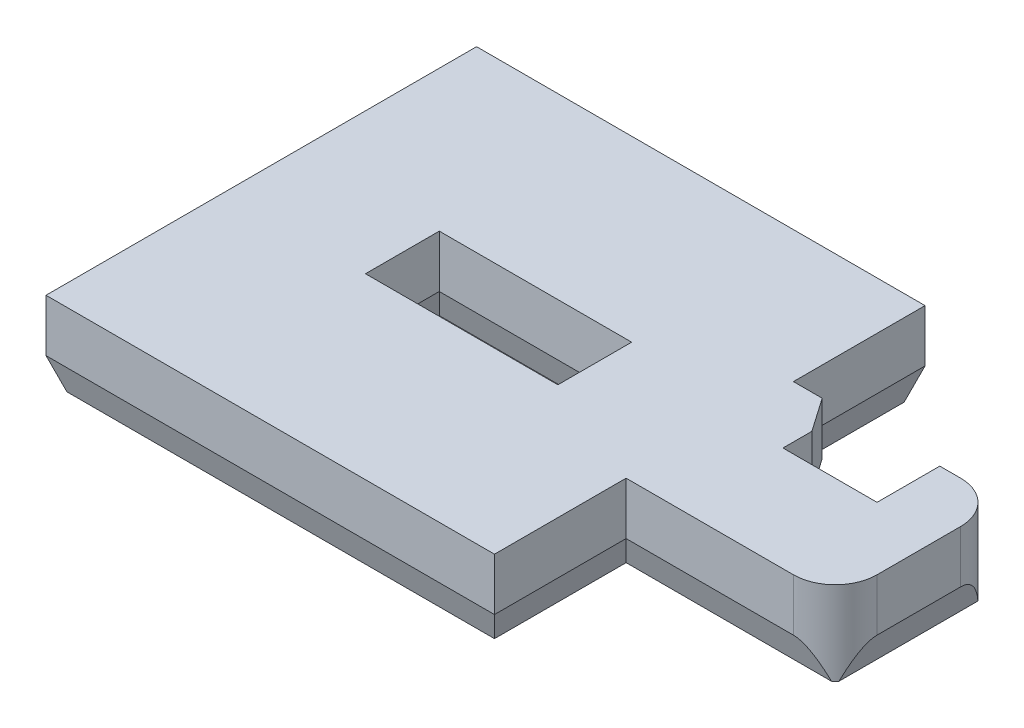
ISO-10303-21;
HEADER;
FILE_DESCRIPTION(('STEP AP214'),'2;1');
FILE_NAME('part.step','',(''),(''),'','','');
FILE_SCHEMA(('AUTOMOTIVE_DESIGN { 1 0 10303 214 1 1 1 1 }'));
ENDSEC;
DATA;
#1=APPLICATION_CONTEXT('core data for automotive mechanical design processes');
#2=APPLICATION_PROTOCOL_DEFINITION('international standard','automotive_design',2000,#1);
#3=PRODUCT_CONTEXT('',#1,'mechanical');
#4=PRODUCT('Part','Part','',(#3));
#5=PRODUCT_RELATED_PRODUCT_CATEGORY('part','',(#4));
#6=PRODUCT_DEFINITION_FORMATION('','',#4);
#7=PRODUCT_DEFINITION_CONTEXT('part definition',#1,'design');
#8=PRODUCT_DEFINITION('design','',#6,#7);
#9=PRODUCT_DEFINITION_SHAPE('','',#8);
#10=(LENGTH_UNIT() NAMED_UNIT(*) SI_UNIT(.MILLI.,.METRE.));
#11=(NAMED_UNIT(*) PLANE_ANGLE_UNIT() SI_UNIT($,.RADIAN.));
#12=(NAMED_UNIT(*) SI_UNIT($,.STERADIAN.) SOLID_ANGLE_UNIT());
#13=UNCERTAINTY_MEASURE_WITH_UNIT(LENGTH_MEASURE(1.E-05),#10,'distance_accuracy_value','');
#14=(GEOMETRIC_REPRESENTATION_CONTEXT(3) GLOBAL_UNCERTAINTY_ASSIGNED_CONTEXT((#13)) GLOBAL_UNIT_ASSIGNED_CONTEXT((#10,
#11,#12)) REPRESENTATION_CONTEXT('',''));
#15=CARTESIAN_POINT('',(0.,0.,0.));
#16=DIRECTION('',(0.,0.,1.));
#17=DIRECTION('',(1.,0.,0.));
#18=AXIS2_PLACEMENT_3D('',#15,#16,#17);
#19=CARTESIAN_POINT('',(0.,4.,0.));
#20=DIRECTION('',(0.,1.,0.));
#21=DIRECTION('',(0.,0.,1.));
#22=AXIS2_PLACEMENT_3D('',#19,#20,#21);
#23=PLANE('',#22);
#24=DIRECTION('',(-1.,0.,0.));
#25=VECTOR('',#24,1.);
#26=CARTESIAN_POINT('',(4.7,4.,-1.765));
#27=LINE('',#26,#25);
#28=CARTESIAN_POINT('',(4.7,4.,-1.765));
#29=VERTEX_POINT('',#28);
#30=CARTESIAN_POINT('',(-4.5,4.,-1.765));
#31=VERTEX_POINT('',#30);
#32=EDGE_CURVE('E261',#29,#31,#27,.T.);
#33=ORIENTED_EDGE('',*,*,#32,.F.);
#34=DIRECTION('',(0.,0.,-1.));
#35=VECTOR('',#34,1.);
#36=CARTESIAN_POINT('',(4.7,4.,1.765));
#37=LINE('',#36,#35);
#38=CARTESIAN_POINT('',(4.7,4.,1.765));
#39=VERTEX_POINT('',#38);
#40=EDGE_CURVE('E259',#39,#29,#37,.T.);
#41=ORIENTED_EDGE('',*,*,#40,.F.);
#42=DIRECTION('',(1.,0.,0.));
#43=VECTOR('',#42,1.);
#44=CARTESIAN_POINT('',(4.7,4.,1.765));
#45=LINE('',#44,#43);
#46=CARTESIAN_POINT('',(-4.5,4.,1.765));
#47=VERTEX_POINT('',#46);
#48=EDGE_CURVE('E266',#47,#39,#45,.T.);
#49=ORIENTED_EDGE('',*,*,#48,.F.);
#50=DIRECTION('',(0.,0.,1.));
#51=VECTOR('',#50,1.);
#52=CARTESIAN_POINT('',(-4.5,4.,1.765));
#53=LINE('',#52,#51);
#54=EDGE_CURVE('E263',#31,#47,#53,.T.);
#55=ORIENTED_EDGE('',*,*,#54,.F.);
#56=EDGE_LOOP('',(#33,#41,#49,#55));
#57=FACE_BOUND('',#56,.T.);
#58=DIRECTION('',(0.,0.,-1.));
#59=VECTOR('',#58,1.);
#60=CARTESIAN_POINT('',(20.2,4.,-4.));
#61=LINE('',#60,#59);
#62=CARTESIAN_POINT('',(20.2,4.,2.));
#63=VERTEX_POINT('',#62);
#64=CARTESIAN_POINT('',(20.2,4.,-2.));
#65=VERTEX_POINT('',#64);
#66=EDGE_CURVE('E250',#63,#65,#61,.T.);
#67=ORIENTED_EDGE('',*,*,#66,.T.);
#68=CARTESIAN_POINT('',(18.2,4.,-2.));
#69=DIRECTION('',(0.,1.,0.));
#70=DIRECTION('',(0.,0.,1.));
#71=AXIS2_PLACEMENT_3D('',#68,#69,#70);
#72=CIRCLE('',#71,2.);
#73=CARTESIAN_POINT('',(18.2,4.,-4.));
#74=VERTEX_POINT('',#73);
#75=EDGE_CURVE('E436',#65,#74,#72,.T.);
#76=ORIENTED_EDGE('',*,*,#75,.T.);
#77=DIRECTION('',(-1.,0.,0.));
#78=VECTOR('',#77,1.);
#79=CARTESIAN_POINT('',(10.2,4.,-4.));
#80=LINE('',#79,#78);
#81=CARTESIAN_POINT('',(17.2,4.,-4.));
#82=VERTEX_POINT('',#81);
#83=EDGE_CURVE('E249',#74,#82,#80,.T.);
#84=ORIENTED_EDGE('',*,*,#83,.T.);
#85=DIRECTION('',(0.,0.,-1.));
#86=VECTOR('',#85,1.);
#87=CARTESIAN_POINT('',(17.2,4.,-4.));
#88=LINE('',#87,#86);
#89=CARTESIAN_POINT('',(17.2,4.,-1.));
#90=VERTEX_POINT('',#89);
#91=EDGE_CURVE('E944',#90,#82,#88,.T.);
#92=ORIENTED_EDGE('',*,*,#91,.F.);
#93=DIRECTION('',(1.,0.,0.));
#94=VECTOR('',#93,1.);
#95=CARTESIAN_POINT('',(12.7,4.,-1.));
#96=LINE('',#95,#94);
#97=CARTESIAN_POINT('',(12.7,4.,-1.));
#98=VERTEX_POINT('',#97);
#99=EDGE_CURVE('E945',#98,#90,#96,.T.);
#100=ORIENTED_EDGE('',*,*,#99,.F.);
#101=DIRECTION('',(0.,0.,1.));
#102=VECTOR('',#101,1.);
#103=CARTESIAN_POINT('',(12.7,4.,-1.));
#104=LINE('',#103,#102);
#105=CARTESIAN_POINT('',(12.7,4.,-2.38454446993003));
#106=VERTEX_POINT('',#105);
#107=EDGE_CURVE('E242',#106,#98,#104,.T.);
#108=ORIENTED_EDGE('',*,*,#107,.F.);
#109=DIRECTION('',(0.571066249139347,0.,0.820903976780425));
#110=VECTOR('',#109,1.);
#111=CARTESIAN_POINT('',(12.7,4.,-2.38454446993003));
#112=LINE('',#111,#110);
#113=CARTESIAN_POINT('',(11.5761997062962,4.,-4.));
#114=VERTEX_POINT('',#113);
#115=EDGE_CURVE('E225',#114,#106,#112,.T.);
#116=ORIENTED_EDGE('',*,*,#115,.F.);
#117=CARTESIAN_POINT('',(10.2,4.,-4.));
#118=VERTEX_POINT('',#117);
#119=EDGE_CURVE('E239',#114,#118,#80,.T.);
#120=ORIENTED_EDGE('',*,*,#119,.T.);
#121=DIRECTION('',(0.,0.,-1.));
#122=VECTOR('',#121,1.);
#123=CARTESIAN_POINT('',(10.2,4.,-10.2954940680572));
#124=LINE('',#123,#122);
#125=CARTESIAN_POINT('',(10.2,4.,-10.2954940680572));
#126=VERTEX_POINT('',#125);
#127=EDGE_CURVE('E285',#118,#126,#124,.T.);
#128=ORIENTED_EDGE('',*,*,#127,.T.);
#129=DIRECTION('',(-1.,0.,0.));
#130=VECTOR('',#129,1.);
#131=CARTESIAN_POINT('',(-11.2475157139505,4.,-10.2954940680572));
#132=LINE('',#131,#130);
#133=CARTESIAN_POINT('',(-11.2475157139505,4.,-10.2954940680572));
#134=VERTEX_POINT('',#133);
#135=EDGE_CURVE('E289',#126,#134,#132,.T.);
#136=ORIENTED_EDGE('',*,*,#135,.T.);
#137=DIRECTION('',(0.,0.,1.));
#138=VECTOR('',#137,1.);
#139=CARTESIAN_POINT('',(-11.2475157139505,4.,-10.2954940680572));
#140=LINE('',#139,#138);
#141=CARTESIAN_POINT('',(-11.2475157139505,4.,10.2954940680572));
#142=VERTEX_POINT('',#141);
#143=EDGE_CURVE('E280',#134,#142,#140,.T.);
#144=ORIENTED_EDGE('',*,*,#143,.T.);
#145=DIRECTION('',(1.,0.,0.));
#146=VECTOR('',#145,1.);
#147=CARTESIAN_POINT('',(-11.2475157139505,4.,10.2954940680572));
#148=LINE('',#147,#146);
#149=CARTESIAN_POINT('',(10.2,4.,10.2954940680572));
#150=VERTEX_POINT('',#149);
#151=EDGE_CURVE('E283',#142,#150,#148,.T.);
#152=ORIENTED_EDGE('',*,*,#151,.T.);
#153=CARTESIAN_POINT('',(10.2,4.,4.));
#154=VERTEX_POINT('',#153);
#155=EDGE_CURVE('E286',#150,#154,#124,.T.);
#156=ORIENTED_EDGE('',*,*,#155,.T.);
#157=DIRECTION('',(1.,0.,0.));
#158=VECTOR('',#157,1.);
#159=CARTESIAN_POINT('',(20.2,4.,4.));
#160=LINE('',#159,#158);
#161=CARTESIAN_POINT('',(18.2,4.,4.));
#162=VERTEX_POINT('',#161);
#163=EDGE_CURVE('E233',#154,#162,#160,.T.);
#164=ORIENTED_EDGE('',*,*,#163,.T.);
#165=CARTESIAN_POINT('',(18.2,4.,2.));
#166=DIRECTION('',(0.,1.,0.));
#167=DIRECTION('',(0.,0.,1.));
#168=AXIS2_PLACEMENT_3D('',#165,#166,#167);
#169=CIRCLE('',#168,2.);
#170=EDGE_CURVE('E434',#162,#63,#169,.T.);
#171=ORIENTED_EDGE('',*,*,#170,.T.);
#172=EDGE_LOOP('',(#67,#76,#84,#92,#100,#108,#116,#120,#128,#136,#144,#152,#156,#164,#171));
#173=FACE_BOUND('',#172,.T.);
#174=ADVANCED_FACE('F35',(#57,#173),#23,.T.);
#175=CARTESIAN_POINT('',(0.,0.,0.));
#176=DIRECTION('',(0.,1.,0.));
#177=DIRECTION('',(0.,0.,1.));
#178=AXIS2_PLACEMENT_3D('',#175,#176,#177);
#179=PLANE('',#178);
#180=DIRECTION('',(1.,0.,0.));
#181=VECTOR('',#180,1.);
#182=CARTESIAN_POINT('',(0.,0.,-3.5));
#183=LINE('',#182,#181);
#184=CARTESIAN_POINT('',(17.7,0.,-3.5));
#185=VERTEX_POINT('',#184);
#186=CARTESIAN_POINT('',(19.5228756555323,0.,-3.5));
#187=VERTEX_POINT('',#186);
#188=EDGE_CURVE('E322',#185,#187,#183,.T.);
#189=ORIENTED_EDGE('',*,*,#188,.T.);
#190=CARTESIAN_POINT('',(18.2,0.,-2.));
#191=DIRECTION('',(0.,1.,0.));
#192=DIRECTION('',(0.,0.,1.));
#193=AXIS2_PLACEMENT_3D('',#190,#191,#192);
#194=CIRCLE('',#193,2.);
#195=CARTESIAN_POINT('',(19.7,0.,-3.3228756555323));
#196=VERTEX_POINT('',#195);
#197=EDGE_CURVE('E423',#187,#196,#194,.F.);
#198=ORIENTED_EDGE('',*,*,#197,.T.);
#199=DIRECTION('',(0.,0.,1.));
#200=VECTOR('',#199,1.);
#201=CARTESIAN_POINT('',(19.7,0.,0.));
#202=LINE('',#201,#200);
#203=CARTESIAN_POINT('',(19.7,0.,3.3228756555323));
#204=VERTEX_POINT('',#203);
#205=EDGE_CURVE('E325',#196,#204,#202,.T.);
#206=ORIENTED_EDGE('',*,*,#205,.T.);
#207=CARTESIAN_POINT('',(18.2,0.,2.));
#208=DIRECTION('',(0.,1.,0.));
#209=DIRECTION('',(0.,0.,1.));
#210=AXIS2_PLACEMENT_3D('',#207,#208,#209);
#211=CIRCLE('',#210,2.);
#212=CARTESIAN_POINT('',(19.5228756555323,0.,3.5));
#213=VERTEX_POINT('',#212);
#214=EDGE_CURVE('E421',#204,#213,#211,.F.);
#215=ORIENTED_EDGE('',*,*,#214,.T.);
#216=DIRECTION('',(-1.,0.,0.));
#217=VECTOR('',#216,1.);
#218=CARTESIAN_POINT('',(0.,0.,3.5));
#219=LINE('',#218,#217);
#220=CARTESIAN_POINT('',(9.7,0.,3.5));
#221=VERTEX_POINT('',#220);
#222=EDGE_CURVE('E328',#213,#221,#219,.T.);
#223=ORIENTED_EDGE('',*,*,#222,.T.);
#224=DIRECTION('',(0.,0.,1.));
#225=VECTOR('',#224,1.);
#226=CARTESIAN_POINT('',(9.7,0.,0.));
#227=LINE('',#226,#225);
#228=CARTESIAN_POINT('',(9.7,0.,9.7954940680572));
#229=VERTEX_POINT('',#228);
#230=EDGE_CURVE('E330',#221,#229,#227,.T.);
#231=ORIENTED_EDGE('',*,*,#230,.T.);
#232=DIRECTION('',(-1.,0.,0.));
#233=VECTOR('',#232,1.);
#234=CARTESIAN_POINT('',(0.,0.,9.7954940680572));
#235=LINE('',#234,#233);
#236=CARTESIAN_POINT('',(-10.7475157139505,0.,9.7954940680572));
#237=VERTEX_POINT('',#236);
#238=EDGE_CURVE('E332',#229,#237,#235,.T.);
#239=ORIENTED_EDGE('',*,*,#238,.T.);
#240=DIRECTION('',(0.,0.,-1.));
#241=VECTOR('',#240,1.);
#242=CARTESIAN_POINT('',(-10.7475157139505,0.,0.));
#243=LINE('',#242,#241);
#244=CARTESIAN_POINT('',(-10.7475157139505,0.,-9.7954940680572));
#245=VERTEX_POINT('',#244);
#246=EDGE_CURVE('E334',#237,#245,#243,.T.);
#247=ORIENTED_EDGE('',*,*,#246,.T.);
#248=DIRECTION('',(1.,0.,0.));
#249=VECTOR('',#248,1.);
#250=CARTESIAN_POINT('',(0.,0.,-9.7954940680572));
#251=LINE('',#250,#249);
#252=CARTESIAN_POINT('',(9.7,0.,-9.7954940680572));
#253=VERTEX_POINT('',#252);
#254=EDGE_CURVE('E336',#245,#253,#251,.T.);
#255=ORIENTED_EDGE('',*,*,#254,.T.);
#256=DIRECTION('',(0.,0.,1.));
#257=VECTOR('',#256,1.);
#258=CARTESIAN_POINT('',(9.7,0.,0.));
#259=LINE('',#258,#257);
#260=CARTESIAN_POINT('',(9.7,0.,-3.5));
#261=VERTEX_POINT('',#260);
#262=EDGE_CURVE('E338',#253,#261,#259,.T.);
#263=ORIENTED_EDGE('',*,*,#262,.T.);
#264=DIRECTION('',(1.,0.,0.));
#265=VECTOR('',#264,1.);
#266=CARTESIAN_POINT('',(0.,0.,-3.5));
#267=LINE('',#266,#265);
#268=CARTESIAN_POINT('',(11.3149427487267,0.,-3.5));
#269=VERTEX_POINT('',#268);
#270=EDGE_CURVE('E340',#261,#269,#267,.T.);
#271=ORIENTED_EDGE('',*,*,#270,.T.);
#272=DIRECTION('',(0.571066249139347,0.,0.820903976780425));
#273=VECTOR('',#272,1.);
#274=CARTESIAN_POINT('',(12.2895480116098,0.,-2.09901134536036));
#275=LINE('',#274,#273);
#276=CARTESIAN_POINT('',(12.2,0.,-2.22773602302086));
#277=VERTEX_POINT('',#276);
#278=EDGE_CURVE('E314',#269,#277,#275,.T.);
#279=ORIENTED_EDGE('',*,*,#278,.T.);
#280=DIRECTION('',(0.,0.,1.));
#281=VECTOR('',#280,1.);
#282=CARTESIAN_POINT('',(12.2,0.,-1.));
#283=LINE('',#282,#281);
#284=CARTESIAN_POINT('',(12.2,0.,-0.499999999999998));
#285=VERTEX_POINT('',#284);
#286=EDGE_CURVE('E316',#277,#285,#283,.T.);
#287=ORIENTED_EDGE('',*,*,#286,.T.);
#288=DIRECTION('',(1.,0.,0.));
#289=VECTOR('',#288,1.);
#290=CARTESIAN_POINT('',(17.2,0.,-0.499999999999998));
#291=LINE('',#290,#289);
#292=CARTESIAN_POINT('',(17.7,0.,-0.499999999999998));
#293=VERTEX_POINT('',#292);
#294=EDGE_CURVE('E318',#285,#293,#291,.T.);
#295=ORIENTED_EDGE('',*,*,#294,.T.);
#296=DIRECTION('',(0.,0.,-1.));
#297=VECTOR('',#296,1.);
#298=CARTESIAN_POINT('',(17.7,0.,-4.));
#299=LINE('',#298,#297);
#300=EDGE_CURVE('E320',#293,#185,#299,.T.);
#301=ORIENTED_EDGE('',*,*,#300,.T.);
#302=EDGE_LOOP('',(#189,#198,#206,#215,#223,#231,#239,#247,#255,#263,#271,#279,#287,#295,#301));
#303=FACE_BOUND('',#302,.T.);
#304=DIRECTION('',(0.,0.,1.));
#305=VECTOR('',#304,1.);
#306=CARTESIAN_POINT('',(-5.,0.,1.765));
#307=LINE('',#306,#305);
#308=CARTESIAN_POINT('',(-5.,0.,-2.265));
#309=VERTEX_POINT('',#308);
#310=CARTESIAN_POINT('',(-5.,0.,2.265));
#311=VERTEX_POINT('',#310);
#312=EDGE_CURVE('E309',#309,#311,#307,.T.);
#313=ORIENTED_EDGE('',*,*,#312,.T.);
#314=DIRECTION('',(1.,0.,0.));
#315=VECTOR('',#314,1.);
#316=CARTESIAN_POINT('',(4.7,0.,2.265));
#317=LINE('',#316,#315);
#318=CARTESIAN_POINT('',(5.2,0.,2.265));
#319=VERTEX_POINT('',#318);
#320=EDGE_CURVE('E311',#311,#319,#317,.T.);
#321=ORIENTED_EDGE('',*,*,#320,.T.);
#322=DIRECTION('',(0.,0.,-1.));
#323=VECTOR('',#322,1.);
#324=CARTESIAN_POINT('',(5.2,0.,-1.765));
#325=LINE('',#324,#323);
#326=CARTESIAN_POINT('',(5.2,0.,-2.265));
#327=VERTEX_POINT('',#326);
#328=EDGE_CURVE('E305',#319,#327,#325,.T.);
#329=ORIENTED_EDGE('',*,*,#328,.T.);
#330=DIRECTION('',(-1.,0.,0.));
#331=VECTOR('',#330,1.);
#332=CARTESIAN_POINT('',(-4.5,0.,-2.265));
#333=LINE('',#332,#331);
#334=EDGE_CURVE('E307',#327,#309,#333,.T.);
#335=ORIENTED_EDGE('',*,*,#334,.T.);
#336=EDGE_LOOP('',(#313,#321,#329,#335));
#337=FACE_BOUND('',#336,.T.);
#338=ADVANCED_FACE('F459',(#303,#337),#179,.F.);
#339=CARTESIAN_POINT('',(10.2,4.,-4.));
#340=DIRECTION('',(0.,0.,1.));
#341=DIRECTION('',(1.,0.,0.));
#342=AXIS2_PLACEMENT_3D('',#339,#340,#341);
#343=PLANE('',#342);
#344=DIRECTION('',(0.,-1.,0.));
#345=VECTOR('',#344,1.);
#346=CARTESIAN_POINT('',(11.5761997062962,4.,-4.));
#347=LINE('',#346,#345);
#348=CARTESIAN_POINT('',(11.5761997062962,1.50000000000002,-4.));
#349=VERTEX_POINT('',#348);
#350=EDGE_CURVE('E221',#114,#349,#347,.T.);
#351=ORIENTED_EDGE('',*,*,#350,.T.);
#352=DIRECTION('',(-1.,0.,0.));
#353=VECTOR('',#352,1.);
#354=CARTESIAN_POINT('',(10.2,1.50000000000002,-4.));
#355=LINE('',#354,#353);
#356=CARTESIAN_POINT('',(10.2,1.50000000000002,-4.));
#357=VERTEX_POINT('',#356);
#358=EDGE_CURVE('E303',#349,#357,#355,.T.);
#359=ORIENTED_EDGE('',*,*,#358,.T.);
#360=DIRECTION('',(0.,-1.,0.));
#361=VECTOR('',#360,1.);
#362=CARTESIAN_POINT('',(10.2,4.,-4.));
#363=LINE('',#362,#361);
#364=EDGE_CURVE('E247',#118,#357,#363,.T.);
#365=ORIENTED_EDGE('',*,*,#364,.F.);
#366=ORIENTED_EDGE('',*,*,#119,.F.);
#367=EDGE_LOOP('',(#351,#359,#365,#366));
#368=FACE_BOUND('',#367,.T.);
#369=ADVANCED_FACE('F245',(#368),#343,.F.);
#370=ORIENTED_EDGE('',*,*,#83,.F.);
#371=DIRECTION('',(0.,-1.,0.));
#372=VECTOR('',#371,1.);
#373=CARTESIAN_POINT('',(18.2,4.,-4.));
#374=LINE('',#373,#372);
#375=CARTESIAN_POINT('',(18.2,1.50000000000002,-4.));
#376=VERTEX_POINT('',#375);
#377=EDGE_CURVE('E376',#74,#376,#374,.T.);
#378=ORIENTED_EDGE('',*,*,#377,.T.);
#379=DIRECTION('',(-1.,0.,0.));
#380=VECTOR('',#379,1.);
#381=CARTESIAN_POINT('',(10.2,1.50000000000002,-4.));
#382=LINE('',#381,#380);
#383=CARTESIAN_POINT('',(17.2,1.50000000000002,-4.));
#384=VERTEX_POINT('',#383);
#385=EDGE_CURVE('E358',#376,#384,#382,.T.);
#386=ORIENTED_EDGE('',*,*,#385,.T.);
#387=DIRECTION('',(0.,-1.,0.));
#388=VECTOR('',#387,1.);
#389=CARTESIAN_POINT('',(17.2,4.,-4.));
#390=LINE('',#389,#388);
#391=EDGE_CURVE('E450',#82,#384,#390,.T.);
#392=ORIENTED_EDGE('',*,*,#391,.F.);
#393=EDGE_LOOP('',(#370,#378,#386,#392));
#394=FACE_BOUND('',#393,.T.);
#395=ADVANCED_FACE('F447',(#394),#343,.F.);
#396=CARTESIAN_POINT('',(10.2,4.,-10.2954940680572));
#397=DIRECTION('',(-1.,0.,0.));
#398=DIRECTION('',(0.,0.,1.));
#399=AXIS2_PLACEMENT_3D('',#396,#397,#398);
#400=PLANE('',#399);
#401=DIRECTION('',(0.,-1.,0.));
#402=VECTOR('',#401,1.);
#403=CARTESIAN_POINT('',(10.2,4.,10.2954940680572));
#404=LINE('',#403,#402);
#405=CARTESIAN_POINT('',(10.2,1.50000000000002,10.2954940680572));
#406=VERTEX_POINT('',#405);
#407=EDGE_CURVE('E297',#150,#406,#404,.T.);
#408=ORIENTED_EDGE('',*,*,#407,.T.);
#409=DIRECTION('',(0.,0.,-1.));
#410=VECTOR('',#409,1.);
#411=CARTESIAN_POINT('',(10.2,1.50000000000002,-10.2954940680572));
#412=LINE('',#411,#410);
#413=CARTESIAN_POINT('',(10.2,1.50000000000002,4.));
#414=VERTEX_POINT('',#413);
#415=EDGE_CURVE('E351',#406,#414,#412,.T.);
#416=ORIENTED_EDGE('',*,*,#415,.T.);
#417=DIRECTION('',(0.,-1.,0.));
#418=VECTOR('',#417,1.);
#419=CARTESIAN_POINT('',(10.2,4.,4.));
#420=LINE('',#419,#418);
#421=EDGE_CURVE('E256',#154,#414,#420,.T.);
#422=ORIENTED_EDGE('',*,*,#421,.F.);
#423=ORIENTED_EDGE('',*,*,#155,.F.);
#424=EDGE_LOOP('',(#408,#416,#422,#423));
#425=FACE_BOUND('',#424,.T.);
#426=ADVANCED_FACE('F545',(#425),#400,.F.);
#427=CARTESIAN_POINT('',(-11.2475157139505,4.,-10.2954940680572));
#428=DIRECTION('',(1.,0.,0.));
#429=DIRECTION('',(0.,0.,-1.));
#430=AXIS2_PLACEMENT_3D('',#427,#428,#429);
#431=PLANE('',#430);
#432=DIRECTION('',(0.,-1.,0.));
#433=VECTOR('',#432,1.);
#434=CARTESIAN_POINT('',(-11.2475157139505,4.,-10.2954940680572));
#435=LINE('',#434,#433);
#436=CARTESIAN_POINT('',(-11.2475157139505,1.50000000000002,-10.2954940680572));
#437=VERTEX_POINT('',#436);
#438=EDGE_CURVE('E291',#134,#437,#435,.T.);
#439=ORIENTED_EDGE('',*,*,#438,.T.);
#440=DIRECTION('',(0.,0.,1.));
#441=VECTOR('',#440,1.);
#442=CARTESIAN_POINT('',(-11.2475157139505,1.50000000000002,-10.2954940680572));
#443=LINE('',#442,#441);
#444=CARTESIAN_POINT('',(-11.2475157139505,1.50000000000002,10.2954940680572));
#445=VERTEX_POINT('',#444);
#446=EDGE_CURVE('E347',#437,#445,#443,.T.);
#447=ORIENTED_EDGE('',*,*,#446,.T.);
#448=DIRECTION('',(0.,-1.,0.));
#449=VECTOR('',#448,1.);
#450=CARTESIAN_POINT('',(-11.2475157139505,4.,10.2954940680572));
#451=LINE('',#450,#449);
#452=EDGE_CURVE('E300',#142,#445,#451,.T.);
#453=ORIENTED_EDGE('',*,*,#452,.F.);
#454=ORIENTED_EDGE('',*,*,#143,.F.);
#455=EDGE_LOOP('',(#439,#447,#453,#454));
#456=FACE_BOUND('',#455,.T.);
#457=ADVANCED_FACE('F540',(#456),#431,.F.);
#458=CARTESIAN_POINT('',(-11.2475157139505,4.,10.2954940680572));
#459=DIRECTION('',(0.,0.,-1.));
#460=DIRECTION('',(-1.,0.,0.));
#461=AXIS2_PLACEMENT_3D('',#458,#459,#460);
#462=PLANE('',#461);
#463=ORIENTED_EDGE('',*,*,#452,.T.);
#464=DIRECTION('',(1.,0.,0.));
#465=VECTOR('',#464,1.);
#466=CARTESIAN_POINT('',(-11.2475157139505,1.50000000000002,10.2954940680572));
#467=LINE('',#466,#465);
#468=EDGE_CURVE('E349',#445,#406,#467,.T.);
#469=ORIENTED_EDGE('',*,*,#468,.T.);
#470=ORIENTED_EDGE('',*,*,#407,.F.);
#471=ORIENTED_EDGE('',*,*,#151,.F.);
#472=EDGE_LOOP('',(#463,#469,#470,#471));
#473=FACE_BOUND('',#472,.T.);
#474=ADVANCED_FACE('F542',(#473),#462,.F.);
#475=ORIENTED_EDGE('',*,*,#364,.T.);
#476=DIRECTION('',(0.,0.,-1.));
#477=VECTOR('',#476,1.);
#478=CARTESIAN_POINT('',(10.2,1.50000000000002,-10.2954940680572));
#479=LINE('',#478,#477);
#480=CARTESIAN_POINT('',(10.2,1.50000000000002,-10.2954940680572));
#481=VERTEX_POINT('',#480);
#482=EDGE_CURVE('E343',#357,#481,#479,.T.);
#483=ORIENTED_EDGE('',*,*,#482,.T.);
#484=DIRECTION('',(0.,-1.,0.));
#485=VECTOR('',#484,1.);
#486=CARTESIAN_POINT('',(10.2,4.,-10.2954940680572));
#487=LINE('',#486,#485);
#488=EDGE_CURVE('E294',#126,#481,#487,.T.);
#489=ORIENTED_EDGE('',*,*,#488,.F.);
#490=ORIENTED_EDGE('',*,*,#127,.F.);
#491=EDGE_LOOP('',(#475,#483,#489,#490));
#492=FACE_BOUND('',#491,.T.);
#493=ADVANCED_FACE('F532',(#492),#400,.F.);
#494=CARTESIAN_POINT('',(-11.2475157139505,4.,-10.2954940680572));
#495=DIRECTION('',(0.,0.,1.));
#496=DIRECTION('',(1.,0.,0.));
#497=AXIS2_PLACEMENT_3D('',#494,#495,#496);
#498=PLANE('',#497);
#499=ORIENTED_EDGE('',*,*,#488,.T.);
#500=DIRECTION('',(-1.,0.,0.));
#501=VECTOR('',#500,1.);
#502=CARTESIAN_POINT('',(-11.2475157139505,1.50000000000002,-10.2954940680572));
#503=LINE('',#502,#501);
#504=EDGE_CURVE('E345',#481,#437,#503,.T.);
#505=ORIENTED_EDGE('',*,*,#504,.T.);
#506=ORIENTED_EDGE('',*,*,#438,.F.);
#507=ORIENTED_EDGE('',*,*,#135,.F.);
#508=EDGE_LOOP('',(#499,#505,#506,#507));
#509=FACE_BOUND('',#508,.T.);
#510=ADVANCED_FACE('F538',(#509),#498,.F.);
#511=CARTESIAN_POINT('',(4.7,4.,1.765));
#512=DIRECTION('',(-1.,0.,0.));
#513=DIRECTION('',(0.,0.,1.));
#514=AXIS2_PLACEMENT_3D('',#511,#512,#513);
#515=PLANE('',#514);
#516=DIRECTION('',(0.,-1.,0.));
#517=VECTOR('',#516,1.);
#518=CARTESIAN_POINT('',(4.7,4.,-1.765));
#519=LINE('',#518,#517);
#520=CARTESIAN_POINT('',(4.7,1.50000000000002,-1.765));
#521=VERTEX_POINT('',#520);
#522=EDGE_CURVE('E277',#29,#521,#519,.T.);
#523=ORIENTED_EDGE('',*,*,#522,.T.);
#524=DIRECTION('',(0.,0.,1.));
#525=VECTOR('',#524,1.);
#526=CARTESIAN_POINT('',(4.7,1.50000000000002,1.765));
#527=LINE('',#526,#525);
#528=CARTESIAN_POINT('',(4.7,1.50000000000002,1.765));
#529=VERTEX_POINT('',#528);
#530=EDGE_CURVE('E374',#521,#529,#527,.T.);
#531=ORIENTED_EDGE('',*,*,#530,.T.);
#532=DIRECTION('',(0.,-1.,0.));
#533=VECTOR('',#532,1.);
#534=CARTESIAN_POINT('',(4.7,4.,1.765));
#535=LINE('',#534,#533);
#536=EDGE_CURVE('E268',#39,#529,#535,.T.);
#537=ORIENTED_EDGE('',*,*,#536,.F.);
#538=ORIENTED_EDGE('',*,*,#40,.T.);
#539=EDGE_LOOP('',(#523,#531,#537,#538));
#540=FACE_BOUND('',#539,.T.);
#541=ADVANCED_FACE('F567',(#540),#515,.T.);
#542=CARTESIAN_POINT('',(4.7,4.,-1.765));
#543=DIRECTION('',(0.,0.,1.));
#544=DIRECTION('',(1.,0.,0.));
#545=AXIS2_PLACEMENT_3D('',#542,#543,#544);
#546=PLANE('',#545);
#547=DIRECTION('',(0.,-1.,0.));
#548=VECTOR('',#547,1.);
#549=CARTESIAN_POINT('',(-4.5,4.,-1.765));
#550=LINE('',#549,#548);
#551=CARTESIAN_POINT('',(-4.5,1.50000000000002,-1.765));
#552=VERTEX_POINT('',#551);
#553=EDGE_CURVE('E274',#31,#552,#550,.T.);
#554=ORIENTED_EDGE('',*,*,#553,.T.);
#555=DIRECTION('',(1.,0.,0.));
#556=VECTOR('',#555,1.);
#557=CARTESIAN_POINT('',(4.7,1.50000000000002,-1.765));
#558=LINE('',#557,#556);
#559=EDGE_CURVE('E372',#552,#521,#558,.T.);
#560=ORIENTED_EDGE('',*,*,#559,.T.);
#561=ORIENTED_EDGE('',*,*,#522,.F.);
#562=ORIENTED_EDGE('',*,*,#32,.T.);
#563=EDGE_LOOP('',(#554,#560,#561,#562));
#564=FACE_BOUND('',#563,.T.);
#565=ADVANCED_FACE('F869',(#564),#546,.T.);
#566=CARTESIAN_POINT('',(-4.5,4.,1.765));
#567=DIRECTION('',(1.,0.,0.));
#568=DIRECTION('',(0.,0.,-1.));
#569=AXIS2_PLACEMENT_3D('',#566,#567,#568);
#570=PLANE('',#569);
#571=DIRECTION('',(0.,-1.,0.));
#572=VECTOR('',#571,1.);
#573=CARTESIAN_POINT('',(-4.5,4.,1.765));
#574=LINE('',#573,#572);
#575=CARTESIAN_POINT('',(-4.5,1.50000000000002,1.765));
#576=VERTEX_POINT('',#575);
#577=EDGE_CURVE('E271',#47,#576,#574,.T.);
#578=ORIENTED_EDGE('',*,*,#577,.T.);
#579=DIRECTION('',(0.,0.,-1.));
#580=VECTOR('',#579,1.);
#581=CARTESIAN_POINT('',(-4.5,1.50000000000002,-1.765));
#582=LINE('',#581,#580);
#583=EDGE_CURVE('E370',#576,#552,#582,.T.);
#584=ORIENTED_EDGE('',*,*,#583,.T.);
#585=ORIENTED_EDGE('',*,*,#553,.F.);
#586=ORIENTED_EDGE('',*,*,#54,.T.);
#587=EDGE_LOOP('',(#578,#584,#585,#586));
#588=FACE_BOUND('',#587,.T.);
#589=ADVANCED_FACE('F555',(#588),#570,.T.);
#590=CARTESIAN_POINT('',(4.7,4.,1.765));
#591=DIRECTION('',(0.,0.,-1.));
#592=DIRECTION('',(-1.,0.,0.));
#593=AXIS2_PLACEMENT_3D('',#590,#591,#592);
#594=PLANE('',#593);
#595=ORIENTED_EDGE('',*,*,#536,.T.);
#596=DIRECTION('',(-1.,0.,0.));
#597=VECTOR('',#596,1.);
#598=CARTESIAN_POINT('',(-4.5,1.50000000000002,1.765));
#599=LINE('',#598,#597);
#600=EDGE_CURVE('E367',#529,#576,#599,.T.);
#601=ORIENTED_EDGE('',*,*,#600,.T.);
#602=ORIENTED_EDGE('',*,*,#577,.F.);
#603=ORIENTED_EDGE('',*,*,#48,.T.);
#604=EDGE_LOOP('',(#595,#601,#602,#603));
#605=FACE_BOUND('',#604,.T.);
#606=ADVANCED_FACE('F548',(#605),#594,.T.);
#607=CARTESIAN_POINT('',(20.2,4.,4.));
#608=DIRECTION('',(0.,0.,-1.));
#609=DIRECTION('',(-1.,0.,0.));
#610=AXIS2_PLACEMENT_3D('',#607,#608,#609);
#611=PLANE('',#610);
#612=DIRECTION('',(1.,0.,0.));
#613=VECTOR('',#612,1.);
#614=CARTESIAN_POINT('',(20.2,1.50000000000002,4.));
#615=LINE('',#614,#613);
#616=CARTESIAN_POINT('',(18.2,1.50000000000002,4.));
#617=VERTEX_POINT('',#616);
#618=EDGE_CURVE('E353',#414,#617,#615,.T.);
#619=ORIENTED_EDGE('',*,*,#618,.T.);
#620=DIRECTION('',(0.,-1.,0.));
#621=VECTOR('',#620,1.);
#622=CARTESIAN_POINT('',(18.2,4.,4.));
#623=LINE('',#622,#621);
#624=EDGE_CURVE('E11',#617,#162,#623,.F.);
#625=ORIENTED_EDGE('',*,*,#624,.T.);
#626=ORIENTED_EDGE('',*,*,#163,.F.);
#627=ORIENTED_EDGE('',*,*,#421,.T.);
#628=EDGE_LOOP('',(#619,#625,#626,#627));
#629=FACE_BOUND('',#628,.T.);
#630=ADVANCED_FACE('F546',(#629),#611,.F.);
#631=CARTESIAN_POINT('',(20.2,4.,-4.));
#632=DIRECTION('',(-1.,0.,0.));
#633=DIRECTION('',(0.,0.,1.));
#634=AXIS2_PLACEMENT_3D('',#631,#632,#633);
#635=PLANE('',#634);
#636=DIRECTION('',(0.,0.,-1.));
#637=VECTOR('',#636,1.);
#638=CARTESIAN_POINT('',(20.2,1.50000000000002,-4.));
#639=LINE('',#638,#637);
#640=CARTESIAN_POINT('',(20.2,1.50000000000002,2.));
#641=VERTEX_POINT('',#640);
#642=CARTESIAN_POINT('',(20.2,1.50000000000002,-2.));
#643=VERTEX_POINT('',#642);
#644=EDGE_CURVE('E355',#641,#643,#639,.T.);
#645=ORIENTED_EDGE('',*,*,#644,.T.);
#646=DIRECTION('',(0.,-1.,0.));
#647=VECTOR('',#646,1.);
#648=CARTESIAN_POINT('',(20.2,4.,-2.));
#649=LINE('',#648,#647);
#650=EDGE_CURVE('E432',#643,#65,#649,.F.);
#651=ORIENTED_EDGE('',*,*,#650,.T.);
#652=ORIENTED_EDGE('',*,*,#66,.F.);
#653=DIRECTION('',(0.,-1.,0.));
#654=VECTOR('',#653,1.);
#655=CARTESIAN_POINT('',(20.2,4.,2.));
#656=LINE('',#655,#654);
#657=EDGE_CURVE('E429',#63,#641,#656,.T.);
#658=ORIENTED_EDGE('',*,*,#657,.T.);
#659=EDGE_LOOP('',(#645,#651,#652,#658));
#660=FACE_BOUND('',#659,.T.);
#661=ADVANCED_FACE('F495',(#660),#635,.F.);
#662=CARTESIAN_POINT('',(12.7,4.,-2.38454446993003));
#663=DIRECTION('',(0.820903976780425,0.,-0.571066249139347));
#664=DIRECTION('',(-0.571066249139347,0.,-0.820903976780425));
#665=AXIS2_PLACEMENT_3D('',#662,#663,#664);
#666=PLANE('',#665);
#667=DIRECTION('',(0.,-1.,0.));
#668=VECTOR('',#667,1.);
#669=CARTESIAN_POINT('',(12.7,4.,-2.38454446993003));
#670=LINE('',#669,#668);
#671=CARTESIAN_POINT('',(12.7,1.50000000000002,-2.38454446993003));
#672=VERTEX_POINT('',#671);
#673=EDGE_CURVE('E234',#106,#672,#670,.T.);
#674=ORIENTED_EDGE('',*,*,#673,.T.);
#675=DIRECTION('',(-0.571066249139347,0.,-0.820903976780425));
#676=VECTOR('',#675,1.);
#677=CARTESIAN_POINT('',(11.5761997062962,1.50000000000002,-4.));
#678=LINE('',#677,#676);
#679=EDGE_CURVE('E228',#672,#349,#678,.T.);
#680=ORIENTED_EDGE('',*,*,#679,.T.);
#681=ORIENTED_EDGE('',*,*,#350,.F.);
#682=ORIENTED_EDGE('',*,*,#115,.T.);
#683=EDGE_LOOP('',(#674,#680,#681,#682));
#684=FACE_BOUND('',#683,.T.);
#685=ADVANCED_FACE('F224',(#684),#666,.T.);
#686=CARTESIAN_POINT('',(12.7,4.,-1.));
#687=DIRECTION('',(1.,0.,0.));
#688=DIRECTION('',(0.,0.,-1.));
#689=AXIS2_PLACEMENT_3D('',#686,#687,#688);
#690=PLANE('',#689);
#691=DIRECTION('',(0.,-1.,0.));
#692=VECTOR('',#691,1.);
#693=CARTESIAN_POINT('',(12.7,4.,-1.));
#694=LINE('',#693,#692);
#695=CARTESIAN_POINT('',(12.7,1.50000000000002,-1.));
#696=VERTEX_POINT('',#695);
#697=EDGE_CURVE('E478',#98,#696,#694,.T.);
#698=ORIENTED_EDGE('',*,*,#697,.T.);
#699=DIRECTION('',(0.,0.,-1.));
#700=VECTOR('',#699,1.);
#701=CARTESIAN_POINT('',(12.7,1.50000000000002,-2.38454446993003));
#702=LINE('',#701,#700);
#703=EDGE_CURVE('E364',#696,#672,#702,.T.);
#704=ORIENTED_EDGE('',*,*,#703,.T.);
#705=ORIENTED_EDGE('',*,*,#673,.F.);
#706=ORIENTED_EDGE('',*,*,#107,.T.);
#707=EDGE_LOOP('',(#698,#704,#705,#706));
#708=FACE_BOUND('',#707,.T.);
#709=ADVANCED_FACE('F482',(#708),#690,.T.);
#710=CARTESIAN_POINT('',(12.7,4.,-1.));
#711=DIRECTION('',(0.,0.,-1.));
#712=DIRECTION('',(-1.,0.,0.));
#713=AXIS2_PLACEMENT_3D('',#710,#711,#712);
#714=PLANE('',#713);
#715=DIRECTION('',(0.,-1.,0.));
#716=VECTOR('',#715,1.);
#717=CARTESIAN_POINT('',(17.2,4.,-1.));
#718=LINE('',#717,#716);
#719=CARTESIAN_POINT('',(17.2,1.50000000000002,-1.));
#720=VERTEX_POINT('',#719);
#721=EDGE_CURVE('E480',#90,#720,#718,.T.);
#722=ORIENTED_EDGE('',*,*,#721,.T.);
#723=DIRECTION('',(-1.,0.,0.));
#724=VECTOR('',#723,1.);
#725=CARTESIAN_POINT('',(12.7,1.50000000000002,-1.));
#726=LINE('',#725,#724);
#727=EDGE_CURVE('E362',#720,#696,#726,.T.);
#728=ORIENTED_EDGE('',*,*,#727,.T.);
#729=ORIENTED_EDGE('',*,*,#697,.F.);
#730=ORIENTED_EDGE('',*,*,#99,.T.);
#731=EDGE_LOOP('',(#722,#728,#729,#730));
#732=FACE_BOUND('',#731,.T.);
#733=ADVANCED_FACE('F477',(#732),#714,.T.);
#734=CARTESIAN_POINT('',(17.2,4.,-4.));
#735=DIRECTION('',(-1.,0.,0.));
#736=DIRECTION('',(0.,0.,1.));
#737=AXIS2_PLACEMENT_3D('',#734,#735,#736);
#738=PLANE('',#737);
#739=ORIENTED_EDGE('',*,*,#391,.T.);
#740=DIRECTION('',(0.,0.,1.));
#741=VECTOR('',#740,1.);
#742=CARTESIAN_POINT('',(17.2,1.50000000000002,-1.));
#743=LINE('',#742,#741);
#744=EDGE_CURVE('E360',#384,#720,#743,.T.);
#745=ORIENTED_EDGE('',*,*,#744,.T.);
#746=ORIENTED_EDGE('',*,*,#721,.F.);
#747=ORIENTED_EDGE('',*,*,#91,.T.);
#748=EDGE_LOOP('',(#739,#745,#746,#747));
#749=FACE_BOUND('',#748,.T.);
#750=ADVANCED_FACE('F649',(#749),#738,.T.);
#751=CARTESIAN_POINT('',(20.2,1.50000000000002,-4.));
#752=DIRECTION('',(-0.948683298050515,0.316227766016835,0.));
#753=DIRECTION('',(0.,0.,-1.));
#754=AXIS2_PLACEMENT_3D('',#751,#752,#753);
#755=PLANE('',#754);
#756=ORIENTED_EDGE('',*,*,#205,.F.);
#757=CARTESIAN_POINT('',(18.2,-4.50000000000004,-2.));
#758=DIRECTION('',(-0.948683298050515,0.316227766016835,0.));
#759=DIRECTION('',(-0.316227766016835,-0.948683298050515,0.));
#760=AXIS2_PLACEMENT_3D('',#757,#758,#759);
#761=ELLIPSE('',#760,6.32455532033681,2.);
#762=EDGE_CURVE('E427',#196,#643,#761,.F.);
#763=ORIENTED_EDGE('',*,*,#762,.T.);
#764=ORIENTED_EDGE('',*,*,#644,.F.);
#765=CARTESIAN_POINT('',(18.2,-4.50000000000004,2.));
#766=DIRECTION('',(-0.948683298050515,0.316227766016835,0.));
#767=DIRECTION('',(-0.316227766016835,-0.948683298050515,0.));
#768=AXIS2_PLACEMENT_3D('',#765,#766,#767);
#769=ELLIPSE('',#768,6.32455532033681,2.);
#770=EDGE_CURVE('E425',#641,#204,#769,.F.);
#771=ORIENTED_EDGE('',*,*,#770,.T.);
#772=EDGE_LOOP('',(#756,#763,#764,#771));
#773=FACE_BOUND('',#772,.T.);
#774=ADVANCED_FACE('F497',(#773),#755,.F.);
#775=CARTESIAN_POINT('',(20.2,1.50000000000002,4.));
#776=DIRECTION('',(0.,0.316227766016836,-0.948683298050514));
#777=DIRECTION('',(1.,0.,0.));
#778=AXIS2_PLACEMENT_3D('',#775,#776,#777);
#779=PLANE('',#778);
#780=ORIENTED_EDGE('',*,*,#222,.F.);
#781=CARTESIAN_POINT('',(18.2,-4.50000000000002,2.));
#782=DIRECTION('',(0.,0.316227766016836,-0.948683298050514));
#783=DIRECTION('',(0.,-0.948683298050514,-0.316227766016836));
#784=AXIS2_PLACEMENT_3D('',#781,#782,#783);
#785=ELLIPSE('',#784,6.3245553203368,2.);
#786=EDGE_CURVE('E43',#213,#617,#785,.F.);
#787=ORIENTED_EDGE('',*,*,#786,.T.);
#788=ORIENTED_EDGE('',*,*,#618,.F.);
#789=DIRECTION('',(-0.301511344577762,-0.904534033733292,-0.301511344577762));
#790=VECTOR('',#789,1.);
#791=CARTESIAN_POINT('',(8.90040963017663,-2.39877110947011,2.70040963017663));
#792=LINE('',#791,#790);
#793=EDGE_CURVE('E243',#221,#414,#792,.F.);
#794=ORIENTED_EDGE('',*,*,#793,.F.);
#795=EDGE_LOOP('',(#780,#787,#788,#794));
#796=FACE_BOUND('',#795,.T.);
#797=ADVANCED_FACE('F499',(#796),#779,.F.);
#798=CARTESIAN_POINT('',(10.2,1.50000000000002,-4.));
#799=DIRECTION('',(0.,0.316227766016836,0.948683298050514));
#800=DIRECTION('',(-1.,0.,0.));
#801=AXIS2_PLACEMENT_3D('',#798,#799,#800);
#802=PLANE('',#801);
#803=ORIENTED_EDGE('',*,*,#385,.F.);
#804=CARTESIAN_POINT('',(18.2,-4.50000000000002,-2.));
#805=DIRECTION('',(0.,0.316227766016836,0.948683298050514));
#806=DIRECTION('',(0.,-0.948683298050514,0.316227766016836));
#807=AXIS2_PLACEMENT_3D('',#804,#805,#806);
#808=ELLIPSE('',#807,6.3245553203368,2.);
#809=EDGE_CURVE('E419',#376,#187,#808,.F.);
#810=ORIENTED_EDGE('',*,*,#809,.T.);
#811=ORIENTED_EDGE('',*,*,#188,.F.);
#812=DIRECTION('',(-0.301511344577761,0.904534033733292,-0.301511344577762));
#813=VECTOR('',#812,1.);
#814=CARTESIAN_POINT('',(18.0181818181818,-0.95454545454545,-3.18181818181818));
#815=LINE('',#814,#813);
#816=EDGE_CURVE('E403',#384,#185,#815,.F.);
#817=ORIENTED_EDGE('',*,*,#816,.F.);
#818=EDGE_LOOP('',(#803,#810,#811,#817));
#819=FACE_BOUND('',#818,.T.);
#820=ADVANCED_FACE('F456',(#819),#802,.F.);
#821=CARTESIAN_POINT('',(10.2,1.50000000000002,-10.2954940680572));
#822=DIRECTION('',(-0.948683298050514,0.316227766016836,0.));
#823=DIRECTION('',(0.,0.,-1.));
#824=AXIS2_PLACEMENT_3D('',#821,#822,#823);
#825=PLANE('',#824);
#826=ORIENTED_EDGE('',*,*,#793,.T.);
#827=ORIENTED_EDGE('',*,*,#415,.F.);
#828=DIRECTION('',(-0.301511344577762,-0.904534033733292,-0.301511344577762));
#829=VECTOR('',#828,1.);
#830=CARTESIAN_POINT('',(8.32809198762599,-4.11572403712207,8.42358605568318));
#831=LINE('',#830,#829);
#832=EDGE_CURVE('E400',#229,#406,#831,.F.);
#833=ORIENTED_EDGE('',*,*,#832,.F.);
#834=ORIENTED_EDGE('',*,*,#230,.F.);
#835=EDGE_LOOP('',(#826,#827,#833,#834));
#836=FACE_BOUND('',#835,.T.);
#837=ADVANCED_FACE('F504',(#836),#825,.F.);
#838=CARTESIAN_POINT('',(17.7,0.,0.));
#839=DIRECTION('',(-0.948683298050515,-0.316227766016835,0.));
#840=DIRECTION('',(0.,0.,1.));
#841=AXIS2_PLACEMENT_3D('',#838,#839,#840);
#842=PLANE('',#841);
#843=ORIENTED_EDGE('',*,*,#816,.T.);
#844=ORIENTED_EDGE('',*,*,#300,.F.);
#845=DIRECTION('',(0.301511344577761,-0.904534033733292,0.301511344577762));
#846=VECTOR('',#845,1.);
#847=CARTESIAN_POINT('',(17.7454545454545,-0.136363636363635,-0.454545454545454));
#848=LINE('',#847,#846);
#849=EDGE_CURVE('E397',#720,#293,#848,.T.);
#850=ORIENTED_EDGE('',*,*,#849,.F.);
#851=ORIENTED_EDGE('',*,*,#744,.F.);
#852=EDGE_LOOP('',(#843,#844,#850,#851));
#853=FACE_BOUND('',#852,.T.);
#854=ADVANCED_FACE('F466',(#853),#842,.T.);
#855=CARTESIAN_POINT('',(-11.2475157139505,1.50000000000002,10.2954940680572));
#856=DIRECTION('',(0.,0.316227766016836,-0.948683298050514));
#857=DIRECTION('',(1.,0.,0.));
#858=AXIS2_PLACEMENT_3D('',#855,#856,#857);
#859=PLANE('',#858);
#860=ORIENTED_EDGE('',*,*,#832,.T.);
#861=ORIENTED_EDGE('',*,*,#468,.F.);
#862=DIRECTION('',(0.301511344577762,-0.904534033733292,-0.301511344577762));
#863=VECTOR('',#862,1.);
#864=CARTESIAN_POINT('',(-11.2475157139505,1.50000000000002,10.2954940680572));
#865=LINE('',#864,#863);
#866=EDGE_CURVE('E394',#237,#445,#865,.F.);
#867=ORIENTED_EDGE('',*,*,#866,.F.);
#868=ORIENTED_EDGE('',*,*,#238,.F.);
#869=EDGE_LOOP('',(#860,#861,#867,#868));
#870=FACE_BOUND('',#869,.T.);
#871=ADVANCED_FACE('F511',(#870),#859,.F.);
#872=CARTESIAN_POINT('',(0.,0.,-0.499999999999998));
#873=DIRECTION('',(0.,-0.316227766016836,-0.948683298050514));
#874=DIRECTION('',(-1.,0.,0.));
#875=AXIS2_PLACEMENT_3D('',#872,#873,#874);
#876=PLANE('',#875);
#877=ORIENTED_EDGE('',*,*,#849,.T.);
#878=ORIENTED_EDGE('',*,*,#294,.F.);
#879=DIRECTION('',(-0.301511344577762,-0.904534033733292,0.301511344577762));
#880=VECTOR('',#879,1.);
#881=CARTESIAN_POINT('',(11.0909090909091,-3.32727272727272,0.609090909090899));
#882=LINE('',#881,#880);
#883=EDGE_CURVE('E391',#696,#285,#882,.T.);
#884=ORIENTED_EDGE('',*,*,#883,.F.);
#885=ORIENTED_EDGE('',*,*,#727,.F.);
#886=EDGE_LOOP('',(#877,#878,#884,#885));
#887=FACE_BOUND('',#886,.T.);
#888=ADVANCED_FACE('F470',(#887),#876,.T.);
#889=CARTESIAN_POINT('',(-11.2475157139505,1.50000000000002,-10.2954940680572));
#890=DIRECTION('',(0.948683298050514,0.316227766016836,0.));
#891=DIRECTION('',(0.,0.,1.));
#892=AXIS2_PLACEMENT_3D('',#889,#890,#891);
#893=PLANE('',#892);
#894=ORIENTED_EDGE('',*,*,#866,.T.);
#895=ORIENTED_EDGE('',*,*,#446,.F.);
#896=DIRECTION('',(0.301511344577762,-0.904534033733292,0.301511344577762));
#897=VECTOR('',#896,1.);
#898=CARTESIAN_POINT('',(-11.2475157139505,1.50000000000002,-10.2954940680572));
#899=LINE('',#898,#897);
#900=EDGE_CURVE('E388',#245,#437,#899,.F.);
#901=ORIENTED_EDGE('',*,*,#900,.F.);
#902=ORIENTED_EDGE('',*,*,#246,.F.);
#903=EDGE_LOOP('',(#894,#895,#901,#902));
#904=FACE_BOUND('',#903,.T.);
#905=ADVANCED_FACE('F514',(#904),#893,.F.);
#906=CARTESIAN_POINT('',(12.2,0.,0.));
#907=DIRECTION('',(0.948683298050514,-0.316227766016836,0.));
#908=DIRECTION('',(0.,0.,-1.));
#909=AXIS2_PLACEMENT_3D('',#906,#907,#908);
#910=PLANE('',#909);
#911=ORIENTED_EDGE('',*,*,#883,.T.);
#912=ORIENTED_EDGE('',*,*,#286,.F.);
#913=DIRECTION('',(-0.314684006638235,-0.94405201991471,0.098690220696195));
#914=VECTOR('',#913,1.);
#915=CARTESIAN_POINT('',(12.0404252780191,-0.478724165942593,-2.17769069438129));
#916=LINE('',#915,#914);
#917=EDGE_CURVE('E385',#672,#277,#916,.T.);
#918=ORIENTED_EDGE('',*,*,#917,.F.);
#919=ORIENTED_EDGE('',*,*,#703,.F.);
#920=EDGE_LOOP('',(#911,#912,#918,#919));
#921=FACE_BOUND('',#920,.T.);
#922=ADVANCED_FACE('F603',(#921),#910,.T.);
#923=CARTESIAN_POINT('',(-11.2475157139505,1.50000000000002,-10.2954940680572));
#924=DIRECTION('',(0.,0.316227766016836,0.948683298050514));
#925=DIRECTION('',(-1.,0.,0.));
#926=AXIS2_PLACEMENT_3D('',#923,#924,#925);
#927=PLANE('',#926);
#928=ORIENTED_EDGE('',*,*,#900,.T.);
#929=ORIENTED_EDGE('',*,*,#504,.F.);
#930=DIRECTION('',(-0.301511344577762,-0.904534033733292,0.301511344577762));
#931=VECTOR('',#930,1.);
#932=CARTESIAN_POINT('',(8.25022584418634,-4.34932246744102,-8.34571991224353));
#933=LINE('',#932,#931);
#934=EDGE_CURVE('E382',#253,#481,#933,.F.);
#935=ORIENTED_EDGE('',*,*,#934,.F.);
#936=ORIENTED_EDGE('',*,*,#254,.F.);
#937=EDGE_LOOP('',(#928,#929,#935,#936));
#938=FACE_BOUND('',#937,.T.);
#939=ADVANCED_FACE('F519',(#938),#927,.F.);
#940=CARTESIAN_POINT('',(9.26571834340097,0.,-6.44574660327533));
#941=DIRECTION('',(0.778777892074837,-0.316227766016837,-0.541761012638853));
#942=DIRECTION('',(-0.571066249139347,0.,-0.820903976780425));
#943=AXIS2_PLACEMENT_3D('',#940,#941,#942);
#944=PLANE('',#943);
#945=ORIENTED_EDGE('',*,*,#917,.T.);
#946=ORIENTED_EDGE('',*,*,#278,.F.);
#947=DIRECTION('',(-0.163022961056532,-0.935992074085847,0.311997358028614));
#948=VECTOR('',#947,1.);
#949=CARTESIAN_POINT('',(11.4103102887557,0.547550240859785,-3.68251674695326));
#950=LINE('',#949,#948);
#951=EDGE_CURVE('E379',#349,#269,#950,.T.);
#952=ORIENTED_EDGE('',*,*,#951,.F.);
#953=ORIENTED_EDGE('',*,*,#679,.F.);
#954=EDGE_LOOP('',(#945,#946,#952,#953));
#955=FACE_BOUND('',#954,.T.);
#956=ADVANCED_FACE('F591',(#955),#944,.T.);
#957=CARTESIAN_POINT('',(10.2,1.50000000000002,-10.2954940680572));
#958=DIRECTION('',(-0.948683298050514,0.316227766016836,0.));
#959=DIRECTION('',(0.,0.,-1.));
#960=AXIS2_PLACEMENT_3D('',#957,#958,#959);
#961=PLANE('',#960);
#962=ORIENTED_EDGE('',*,*,#934,.T.);
#963=ORIENTED_EDGE('',*,*,#482,.F.);
#964=DIRECTION('',(-0.301511344577762,-0.904534033733292,0.301511344577762));
#965=VECTOR('',#964,1.);
#966=CARTESIAN_POINT('',(10.2,1.50000000000002,-4.));
#967=LINE('',#966,#965);
#968=EDGE_CURVE('E377',#261,#357,#967,.F.);
#969=ORIENTED_EDGE('',*,*,#968,.F.);
#970=ORIENTED_EDGE('',*,*,#262,.F.);
#971=EDGE_LOOP('',(#962,#963,#969,#970));
#972=FACE_BOUND('',#971,.T.);
#973=ADVANCED_FACE('F529',(#972),#961,.F.);
#974=CARTESIAN_POINT('',(10.2,1.50000000000002,-4.));
#975=DIRECTION('',(0.,0.316227766016836,0.948683298050514));
#976=DIRECTION('',(-1.,0.,0.));
#977=AXIS2_PLACEMENT_3D('',#974,#975,#976);
#978=PLANE('',#977);
#979=ORIENTED_EDGE('',*,*,#951,.T.);
#980=ORIENTED_EDGE('',*,*,#270,.F.);
#981=ORIENTED_EDGE('',*,*,#968,.T.);
#982=ORIENTED_EDGE('',*,*,#358,.F.);
#983=EDGE_LOOP('',(#979,#980,#981,#982));
#984=FACE_BOUND('',#983,.T.);
#985=ADVANCED_FACE('F525',(#984),#978,.F.);
#986=CARTESIAN_POINT('',(0.,0.,-2.265));
#987=DIRECTION('',(0.,-0.316227766016835,0.948683298050515));
#988=DIRECTION('',(1.,0.,0.));
#989=AXIS2_PLACEMENT_3D('',#986,#987,#988);
#990=PLANE('',#989);
#991=DIRECTION('',(0.301511344577761,-0.904534033733292,-0.301511344577761));
#992=VECTOR('',#991,1.);
#993=CARTESIAN_POINT('',(4.72727272727273,1.41818181818181,-1.79227272727273));
#994=LINE('',#993,#992);
#995=EDGE_CURVE('E412',#521,#327,#994,.T.);
#996=ORIENTED_EDGE('',*,*,#995,.F.);
#997=ORIENTED_EDGE('',*,*,#559,.F.);
#998=DIRECTION('',(-0.301511344577761,-0.904534033733292,-0.301511344577761));
#999=VECTOR('',#998,1.);
#1000=CARTESIAN_POINT('',(-4.79409090909091,0.617727272727269,-2.05909090909091));
#1001=LINE('',#1000,#999);
#1002=EDGE_CURVE('E380',#309,#552,#1001,.F.);
#1003=ORIENTED_EDGE('',*,*,#1002,.F.);
#1004=ORIENTED_EDGE('',*,*,#334,.F.);
#1005=EDGE_LOOP('',(#996,#997,#1003,#1004));
#1006=FACE_BOUND('',#1005,.T.);
#1007=ADVANCED_FACE('F585',(#1006),#990,.T.);
#1008=CARTESIAN_POINT('',(-5.,0.,0.));
#1009=DIRECTION('',(0.948683298050515,-0.316227766016835,0.));
#1010=DIRECTION('',(0.,0.,-1.));
#1011=AXIS2_PLACEMENT_3D('',#1008,#1009,#1010);
#1012=PLANE('',#1011);
#1013=ORIENTED_EDGE('',*,*,#1002,.T.);
#1014=ORIENTED_EDGE('',*,*,#583,.F.);
#1015=DIRECTION('',(-0.301511344577761,-0.904534033733292,0.301511344577761));
#1016=VECTOR('',#1015,1.);
#1017=CARTESIAN_POINT('',(-4.54545454545455,1.36363636363636,1.81045454545455));
#1018=LINE('',#1017,#1016);
#1019=EDGE_CURVE('E410',#311,#576,#1018,.F.);
#1020=ORIENTED_EDGE('',*,*,#1019,.F.);
#1021=ORIENTED_EDGE('',*,*,#312,.F.);
#1022=EDGE_LOOP('',(#1013,#1014,#1020,#1021));
#1023=FACE_BOUND('',#1022,.T.);
#1024=ADVANCED_FACE('F664',(#1023),#1012,.T.);
#1025=CARTESIAN_POINT('',(5.2,0.,0.));
#1026=DIRECTION('',(-0.948683298050515,-0.316227766016835,0.));
#1027=DIRECTION('',(0.,0.,1.));
#1028=AXIS2_PLACEMENT_3D('',#1025,#1026,#1027);
#1029=PLANE('',#1028);
#1030=ORIENTED_EDGE('',*,*,#995,.T.);
#1031=ORIENTED_EDGE('',*,*,#328,.F.);
#1032=DIRECTION('',(-0.301511344577761,0.904534033733292,-0.301511344577761));
#1033=VECTOR('',#1032,1.);
#1034=CARTESIAN_POINT('',(4.72727272727273,1.41818181818181,1.79227272727273));
#1035=LINE('',#1034,#1033);
#1036=EDGE_CURVE('E408',#529,#319,#1035,.F.);
#1037=ORIENTED_EDGE('',*,*,#1036,.F.);
#1038=ORIENTED_EDGE('',*,*,#530,.F.);
#1039=EDGE_LOOP('',(#1030,#1031,#1037,#1038));
#1040=FACE_BOUND('',#1039,.T.);
#1041=ADVANCED_FACE('F657',(#1040),#1029,.T.);
#1042=CARTESIAN_POINT('',(0.,0.,2.265));
#1043=DIRECTION('',(0.,-0.316227766016835,-0.948683298050515));
#1044=DIRECTION('',(-1.,0.,0.));
#1045=AXIS2_PLACEMENT_3D('',#1042,#1043,#1044);
#1046=PLANE('',#1045);
#1047=ORIENTED_EDGE('',*,*,#1019,.T.);
#1048=ORIENTED_EDGE('',*,*,#600,.F.);
#1049=ORIENTED_EDGE('',*,*,#1036,.T.);
#1050=ORIENTED_EDGE('',*,*,#320,.F.);
#1051=EDGE_LOOP('',(#1047,#1048,#1049,#1050));
#1052=FACE_BOUND('',#1051,.T.);
#1053=ADVANCED_FACE('F651',(#1052),#1046,.T.);
#1054=CARTESIAN_POINT('',(18.2,4.,-2.));
#1055=DIRECTION('',(0.,-1.,0.));
#1056=DIRECTION('',(0.,0.,-1.));
#1057=AXIS2_PLACEMENT_3D('',#1054,#1055,#1056);
#1058=CYLINDRICAL_SURFACE('',#1057,2.);
#1059=ORIENTED_EDGE('',*,*,#75,.F.);
#1060=ORIENTED_EDGE('',*,*,#650,.F.);
#1061=ORIENTED_EDGE('',*,*,#762,.F.);
#1062=ORIENTED_EDGE('',*,*,#197,.F.);
#1063=ORIENTED_EDGE('',*,*,#809,.F.);
#1064=ORIENTED_EDGE('',*,*,#377,.F.);
#1065=EDGE_LOOP('',(#1059,#1060,#1061,#1062,#1063,#1064));
#1066=FACE_BOUND('',#1065,.T.);
#1067=ADVANCED_FACE('F451',(#1066),#1058,.T.);
#1068=CARTESIAN_POINT('',(18.2,4.,2.));
#1069=DIRECTION('',(0.,-1.,0.));
#1070=DIRECTION('',(0.,0.,-1.));
#1071=AXIS2_PLACEMENT_3D('',#1068,#1069,#1070);
#1072=CYLINDRICAL_SURFACE('',#1071,2.);
#1073=ORIENTED_EDGE('',*,*,#170,.F.);
#1074=ORIENTED_EDGE('',*,*,#624,.F.);
#1075=ORIENTED_EDGE('',*,*,#786,.F.);
#1076=ORIENTED_EDGE('',*,*,#214,.F.);
#1077=ORIENTED_EDGE('',*,*,#770,.F.);
#1078=ORIENTED_EDGE('',*,*,#657,.F.);
#1079=EDGE_LOOP('',(#1073,#1074,#1075,#1076,#1077,#1078));
#1080=FACE_BOUND('',#1079,.T.);
#1081=ADVANCED_FACE('F37',(#1080),#1072,.T.);
#1082=CLOSED_SHELL('',(#174,#338,#369,#395,#426,#457,#474,#493,#510,#541,#565,#589,#606,#630,
#661,#685,#709,#733,#750,#774,#797,#820,#837,#854,#871,#888,#905,#922,#939,#956,#973,#985,#1007,
#1024,#1041,#1053,#1067,#1081));
#1083=MANIFOLD_SOLID_BREP('B2',#1082);
#1084=ADVANCED_BREP_SHAPE_REPRESENTATION('',(#18,#1083),#14);
#1085=SHAPE_DEFINITION_REPRESENTATION(#9,#1084);
ENDSEC;
END-ISO-10303-21;
